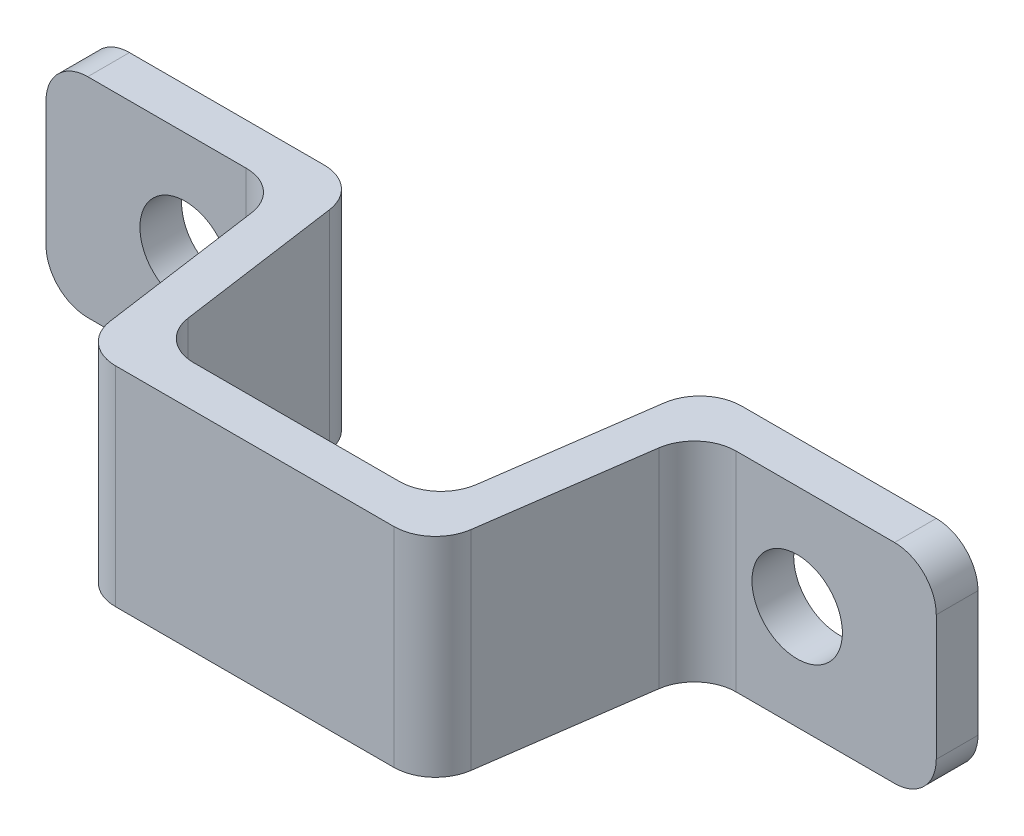
ISO-10303-21;
HEADER;
FILE_DESCRIPTION(('STEP AP214'),'2;1');
FILE_NAME('part.step','',(''),(''),'','','');
FILE_SCHEMA(('AUTOMOTIVE_DESIGN { 1 0 10303 214 1 1 1 1 }'));
ENDSEC;
DATA;
#1=APPLICATION_CONTEXT('core data for automotive mechanical design processes');
#2=APPLICATION_PROTOCOL_DEFINITION('international standard','automotive_design',2000,#1);
#3=PRODUCT_CONTEXT('',#1,'mechanical');
#4=PRODUCT('Part','Part','',(#3));
#5=PRODUCT_RELATED_PRODUCT_CATEGORY('part','',(#4));
#6=PRODUCT_DEFINITION_FORMATION('','',#4);
#7=PRODUCT_DEFINITION_CONTEXT('part definition',#1,'design');
#8=PRODUCT_DEFINITION('design','',#6,#7);
#9=PRODUCT_DEFINITION_SHAPE('','',#8);
#10=(LENGTH_UNIT() NAMED_UNIT(*) SI_UNIT(.MILLI.,.METRE.));
#11=(NAMED_UNIT(*) PLANE_ANGLE_UNIT() SI_UNIT($,.RADIAN.));
#12=(NAMED_UNIT(*) SI_UNIT($,.STERADIAN.) SOLID_ANGLE_UNIT());
#13=UNCERTAINTY_MEASURE_WITH_UNIT(LENGTH_MEASURE(1.E-05),#10,'distance_accuracy_value','');
#14=(GEOMETRIC_REPRESENTATION_CONTEXT(3) GLOBAL_UNCERTAINTY_ASSIGNED_CONTEXT((#13)) GLOBAL_UNIT_ASSIGNED_CONTEXT((#10,
#11,#12)) REPRESENTATION_CONTEXT('',''));
#15=CARTESIAN_POINT('',(0.,0.,0.));
#16=DIRECTION('',(0.,0.,1.));
#17=DIRECTION('',(1.,0.,0.));
#18=AXIS2_PLACEMENT_3D('',#15,#16,#17);
#19=CARTESIAN_POINT('',(32.,7.5,-17.));
#20=DIRECTION('',(-1.,0.,0.));
#21=DIRECTION('',(0.,0.,1.));
#22=AXIS2_PLACEMENT_3D('',#19,#20,#21);
#23=PLANE('',#22);
#24=DIRECTION('',(0.,-1.,0.));
#25=VECTOR('',#24,1.);
#26=CARTESIAN_POINT('',(32.,7.5,-17.));
#27=LINE('',#26,#25);
#28=CARTESIAN_POINT('',(32.,4.5,-17.));
#29=VERTEX_POINT('',#28);
#30=CARTESIAN_POINT('',(32.,-4.5,-17.));
#31=VERTEX_POINT('',#30);
#32=EDGE_CURVE('E262',#29,#31,#27,.T.);
#33=ORIENTED_EDGE('',*,*,#32,.T.);
#34=DIRECTION('',(0.,0.,-1.));
#35=VECTOR('',#34,1.);
#36=CARTESIAN_POINT('',(32.,-4.5,-17.));
#37=LINE('',#36,#35);
#38=CARTESIAN_POINT('',(32.,-4.5,-20.));
#39=VERTEX_POINT('',#38);
#40=EDGE_CURVE('E377',#31,#39,#37,.T.);
#41=ORIENTED_EDGE('',*,*,#40,.T.);
#42=DIRECTION('',(0.,-1.,0.));
#43=VECTOR('',#42,1.);
#44=CARTESIAN_POINT('',(32.,7.5,-20.));
#45=LINE('',#44,#43);
#46=CARTESIAN_POINT('',(32.,4.5,-20.));
#47=VERTEX_POINT('',#46);
#48=EDGE_CURVE('E227',#47,#39,#45,.T.);
#49=ORIENTED_EDGE('',*,*,#48,.F.);
#50=DIRECTION('',(0.,0.,-1.));
#51=VECTOR('',#50,1.);
#52=CARTESIAN_POINT('',(32.,4.5,-17.));
#53=LINE('',#52,#51);
#54=EDGE_CURVE('E374',#47,#29,#53,.F.);
#55=ORIENTED_EDGE('',*,*,#54,.T.);
#56=EDGE_LOOP('',(#33,#41,#49,#55));
#57=FACE_BOUND('',#56,.T.);
#58=ADVANCED_FACE('F44',(#57),#23,.F.);
#59=CARTESIAN_POINT('',(32.,7.5,-20.));
#60=DIRECTION('',(0.,0.,1.));
#61=DIRECTION('',(1.,0.,0.));
#62=AXIS2_PLACEMENT_3D('',#59,#60,#61);
#63=PLANE('',#62);
#64=CARTESIAN_POINT('',(22.,0.,-20.));
#65=DIRECTION('',(0.,0.,1.));
#66=DIRECTION('',(-1.,0.,0.));
#67=AXIS2_PLACEMENT_3D('',#64,#65,#66);
#68=CIRCLE('',#67,3.25);
#69=CARTESIAN_POINT('',(18.75,0.,-20.));
#70=VERTEX_POINT('',#69);
#71=EDGE_CURVE('E499',#70,#70,#68,.T.);
#72=ORIENTED_EDGE('',*,*,#71,.T.);
#73=EDGE_LOOP('',(#72));
#74=FACE_BOUND('',#73,.T.);
#75=ORIENTED_EDGE('',*,*,#48,.T.);
#76=CARTESIAN_POINT('',(29.,-4.5,-20.));
#77=DIRECTION('',(0.,0.,1.));
#78=DIRECTION('',(1.,0.,0.));
#79=AXIS2_PLACEMENT_3D('',#76,#77,#78);
#80=CIRCLE('',#79,3.);
#81=CARTESIAN_POINT('',(29.,-7.5,-20.));
#82=VERTEX_POINT('',#81);
#83=EDGE_CURVE('E384',#39,#82,#80,.F.);
#84=ORIENTED_EDGE('',*,*,#83,.T.);
#85=DIRECTION('',(-1.,0.,0.));
#86=VECTOR('',#85,1.);
#87=CARTESIAN_POINT('',(32.,-7.5,-20.));
#88=LINE('',#87,#86);
#89=CARTESIAN_POINT('',(15.,-7.5,-20.));
#90=VERTEX_POINT('',#89);
#91=EDGE_CURVE('E464',#82,#90,#88,.T.);
#92=ORIENTED_EDGE('',*,*,#91,.T.);
#93=DIRECTION('',(0.,-1.,0.));
#94=VECTOR('',#93,1.);
#95=CARTESIAN_POINT('',(15.,7.5,-20.));
#96=LINE('',#95,#94);
#97=CARTESIAN_POINT('',(15.,7.5,-20.));
#98=VERTEX_POINT('',#97);
#99=EDGE_CURVE('E309',#90,#98,#96,.F.);
#100=ORIENTED_EDGE('',*,*,#99,.T.);
#101=DIRECTION('',(-1.,0.,0.));
#102=VECTOR('',#101,1.);
#103=CARTESIAN_POINT('',(32.,7.5,-20.));
#104=LINE('',#103,#102);
#105=CARTESIAN_POINT('',(29.,7.5,-20.));
#106=VERTEX_POINT('',#105);
#107=EDGE_CURVE('E261',#106,#98,#104,.T.);
#108=ORIENTED_EDGE('',*,*,#107,.F.);
#109=CARTESIAN_POINT('',(29.,4.5,-20.));
#110=DIRECTION('',(0.,0.,1.));
#111=DIRECTION('',(1.,0.,0.));
#112=AXIS2_PLACEMENT_3D('',#109,#110,#111);
#113=CIRCLE('',#112,3.);
#114=EDGE_CURVE('E381',#106,#47,#113,.F.);
#115=ORIENTED_EDGE('',*,*,#114,.T.);
#116=EDGE_LOOP('',(#75,#84,#92,#100,#108,#115));
#117=FACE_BOUND('',#116,.T.);
#118=ADVANCED_FACE('F534',(#74,#117),#63,.F.);
#119=CARTESIAN_POINT('',(12.3926673331197,7.5,-20.));
#120=DIRECTION('',(0.990240166967667,0.,0.139371488202739));
#121=DIRECTION('',(0.139371488202739,0.,-0.990240166967667));
#122=AXIS2_PLACEMENT_3D('',#119,#120,#121);
#123=PLANE('',#122);
#124=DIRECTION('',(-0.139371488202739,0.,0.990240166967667));
#125=VECTOR('',#124,1.);
#126=CARTESIAN_POINT('',(12.3926673331197,7.5,-20.));
#127=LINE('',#126,#125);
#128=CARTESIAN_POINT('',(12.029279499097,7.5,-17.4181144646082));
#129=VERTEX_POINT('',#128);
#130=CARTESIAN_POINT('',(10.3633878340227,7.5,-5.58188553539178));
#131=VERTEX_POINT('',#130);
#132=EDGE_CURVE('E491',#129,#131,#127,.T.);
#133=ORIENTED_EDGE('',*,*,#132,.F.);
#134=DIRECTION('',(0.,-1.,0.));
#135=VECTOR('',#134,1.);
#136=CARTESIAN_POINT('',(12.029279499097,7.5,-17.4181144646082));
#137=LINE('',#136,#135);
#138=CARTESIAN_POINT('',(12.029279499097,-7.5,-17.4181144646082));
#139=VERTEX_POINT('',#138);
#140=EDGE_CURVE('E305',#129,#139,#137,.T.);
#141=ORIENTED_EDGE('',*,*,#140,.T.);
#142=DIRECTION('',(-0.139371488202739,0.,0.990240166967667));
#143=VECTOR('',#142,1.);
#144=CARTESIAN_POINT('',(12.3926673331197,-7.5,-20.));
#145=LINE('',#144,#143);
#146=CARTESIAN_POINT('',(10.3633878340227,-7.5,-5.58188553539178));
#147=VERTEX_POINT('',#146);
#148=EDGE_CURVE('E467',#139,#147,#145,.T.);
#149=ORIENTED_EDGE('',*,*,#148,.T.);
#150=DIRECTION('',(0.,-1.,0.));
#151=VECTOR('',#150,1.);
#152=CARTESIAN_POINT('',(10.3633878340227,7.5,-5.58188553539178));
#153=LINE('',#152,#151);
#154=EDGE_CURVE('E302',#147,#131,#153,.F.);
#155=ORIENTED_EDGE('',*,*,#154,.T.);
#156=EDGE_LOOP('',(#133,#141,#149,#155));
#157=FACE_BOUND('',#156,.T.);
#158=ADVANCED_FACE('F541',(#157),#123,.F.);
#159=CARTESIAN_POINT('',(-10.,7.5,-3.));
#160=DIRECTION('',(0.,0.,1.));
#161=DIRECTION('',(1.,0.,0.));
#162=AXIS2_PLACEMENT_3D('',#159,#160,#161);
#163=PLANE('',#162);
#164=DIRECTION('',(-1.,0.,0.));
#165=VECTOR('',#164,1.);
#166=CARTESIAN_POINT('',(-10.,7.5,-3.));
#167=LINE('',#166,#165);
#168=CARTESIAN_POINT('',(7.39266733311972,7.5,-3.));
#169=VERTEX_POINT('',#168);
#170=CARTESIAN_POINT('',(-7.39266733311972,7.5,-3.));
#171=VERTEX_POINT('',#170);
#172=EDGE_CURVE('E485',#169,#171,#167,.T.);
#173=ORIENTED_EDGE('',*,*,#172,.F.);
#174=DIRECTION('',(0.,-1.,0.));
#175=VECTOR('',#174,1.);
#176=CARTESIAN_POINT('',(7.39266733311972,-7.5,-3.));
#177=LINE('',#176,#175);
#178=CARTESIAN_POINT('',(7.39266733311972,-7.5,-3.));
#179=VERTEX_POINT('',#178);
#180=EDGE_CURVE('E316',#169,#179,#177,.T.);
#181=ORIENTED_EDGE('',*,*,#180,.T.);
#182=DIRECTION('',(-1.,0.,0.));
#183=VECTOR('',#182,1.);
#184=CARTESIAN_POINT('',(-10.,-7.5,-3.));
#185=LINE('',#184,#183);
#186=CARTESIAN_POINT('',(-7.39266733311972,-7.5,-3.));
#187=VERTEX_POINT('',#186);
#188=EDGE_CURVE('E242',#179,#187,#185,.T.);
#189=ORIENTED_EDGE('',*,*,#188,.T.);
#190=DIRECTION('',(0.,-1.,0.));
#191=VECTOR('',#190,1.);
#192=CARTESIAN_POINT('',(-7.39266733311972,7.5,-3.));
#193=LINE('',#192,#191);
#194=EDGE_CURVE('E313',#187,#171,#193,.F.);
#195=ORIENTED_EDGE('',*,*,#194,.T.);
#196=EDGE_LOOP('',(#173,#181,#189,#195));
#197=FACE_BOUND('',#196,.T.);
#198=ADVANCED_FACE('F477',(#197),#163,.F.);
#199=CARTESIAN_POINT('',(-12.3926673331197,7.5,-20.));
#200=DIRECTION('',(-0.990240166967667,0.,0.139371488202739));
#201=DIRECTION('',(0.139371488202739,0.,0.990240166967667));
#202=AXIS2_PLACEMENT_3D('',#199,#200,#201);
#203=PLANE('',#202);
#204=DIRECTION('',(-0.139371488202739,0.,-0.990240166967667));
#205=VECTOR('',#204,1.);
#206=CARTESIAN_POINT('',(-12.3926673331197,-7.5,-20.));
#207=LINE('',#206,#205);
#208=CARTESIAN_POINT('',(-10.3633878340227,-7.5,-5.58188553539178));
#209=VERTEX_POINT('',#208);
#210=CARTESIAN_POINT('',(-12.029279499097,-7.5,-17.4181144646082));
#211=VERTEX_POINT('',#210);
#212=EDGE_CURVE('E236',#209,#211,#207,.T.);
#213=ORIENTED_EDGE('',*,*,#212,.T.);
#214=DIRECTION('',(0.,-1.,0.));
#215=VECTOR('',#214,1.);
#216=CARTESIAN_POINT('',(-12.029279499097,7.5,-17.4181144646082));
#217=LINE('',#216,#215);
#218=CARTESIAN_POINT('',(-12.029279499097,7.5,-17.4181144646082));
#219=VERTEX_POINT('',#218);
#220=EDGE_CURVE('E211',#211,#219,#217,.F.);
#221=ORIENTED_EDGE('',*,*,#220,.T.);
#222=DIRECTION('',(-0.139371488202739,0.,-0.990240166967667));
#223=VECTOR('',#222,1.);
#224=CARTESIAN_POINT('',(-12.3926673331197,7.5,-20.));
#225=LINE('',#224,#223);
#226=CARTESIAN_POINT('',(-10.3633878340227,7.5,-5.58188553539178));
#227=VERTEX_POINT('',#226);
#228=EDGE_CURVE('E428',#227,#219,#225,.T.);
#229=ORIENTED_EDGE('',*,*,#228,.F.);
#230=DIRECTION('',(0.,-1.,0.));
#231=VECTOR('',#230,1.);
#232=CARTESIAN_POINT('',(-10.3633878340227,-7.5,-5.58188553539178));
#233=LINE('',#232,#231);
#234=EDGE_CURVE('E217',#227,#209,#233,.T.);
#235=ORIENTED_EDGE('',*,*,#234,.T.);
#236=EDGE_LOOP('',(#213,#221,#229,#235));
#237=FACE_BOUND('',#236,.T.);
#238=ADVANCED_FACE('F487',(#237),#203,.F.);
#239=CARTESIAN_POINT('',(-32.,7.5,-20.));
#240=DIRECTION('',(0.,0.,1.));
#241=DIRECTION('',(1.,0.,0.));
#242=AXIS2_PLACEMENT_3D('',#239,#240,#241);
#243=PLANE('',#242);
#244=CARTESIAN_POINT('',(-22.,0.,-20.));
#245=DIRECTION('',(0.,0.,1.));
#246=DIRECTION('',(1.,0.,0.));
#247=AXIS2_PLACEMENT_3D('',#244,#245,#246);
#248=CIRCLE('',#247,3.25);
#249=CARTESIAN_POINT('',(-18.75,0.,-20.));
#250=VERTEX_POINT('',#249);
#251=EDGE_CURVE('E468',#250,#250,#248,.T.);
#252=ORIENTED_EDGE('',*,*,#251,.T.);
#253=EDGE_LOOP('',(#252));
#254=FACE_BOUND('',#253,.T.);
#255=DIRECTION('',(-1.,0.,0.));
#256=VECTOR('',#255,1.);
#257=CARTESIAN_POINT('',(-32.,-7.5,-20.));
#258=LINE('',#257,#256);
#259=CARTESIAN_POINT('',(-15.,-7.5,-20.));
#260=VERTEX_POINT('',#259);
#261=CARTESIAN_POINT('',(-29.,-7.5,-20.));
#262=VERTEX_POINT('',#261);
#263=EDGE_CURVE('E222',#260,#262,#258,.T.);
#264=ORIENTED_EDGE('',*,*,#263,.T.);
#265=CARTESIAN_POINT('',(-29.,-4.5,-20.));
#266=DIRECTION('',(0.,0.,1.));
#267=DIRECTION('',(1.,0.,0.));
#268=AXIS2_PLACEMENT_3D('',#265,#266,#267);
#269=CIRCLE('',#268,3.);
#270=CARTESIAN_POINT('',(-32.,-4.5,-20.));
#271=VERTEX_POINT('',#270);
#272=EDGE_CURVE('E11',#262,#271,#269,.F.);
#273=ORIENTED_EDGE('',*,*,#272,.T.);
#274=DIRECTION('',(0.,-1.,0.));
#275=VECTOR('',#274,1.);
#276=CARTESIAN_POINT('',(-32.,7.5,-20.));
#277=LINE('',#276,#275);
#278=CARTESIAN_POINT('',(-32.,4.5,-20.));
#279=VERTEX_POINT('',#278);
#280=EDGE_CURVE('E271',#279,#271,#277,.T.);
#281=ORIENTED_EDGE('',*,*,#280,.F.);
#282=CARTESIAN_POINT('',(-29.,4.5,-20.));
#283=DIRECTION('',(0.,0.,1.));
#284=DIRECTION('',(1.,0.,0.));
#285=AXIS2_PLACEMENT_3D('',#282,#283,#284);
#286=CIRCLE('',#285,3.);
#287=CARTESIAN_POINT('',(-29.,7.5,-20.));
#288=VERTEX_POINT('',#287);
#289=EDGE_CURVE('E53',#279,#288,#286,.F.);
#290=ORIENTED_EDGE('',*,*,#289,.T.);
#291=DIRECTION('',(-1.,0.,0.));
#292=VECTOR('',#291,1.);
#293=CARTESIAN_POINT('',(-32.,7.5,-20.));
#294=LINE('',#293,#292);
#295=CARTESIAN_POINT('',(-15.,7.5,-20.));
#296=VERTEX_POINT('',#295);
#297=EDGE_CURVE('E224',#296,#288,#294,.T.);
#298=ORIENTED_EDGE('',*,*,#297,.F.);
#299=DIRECTION('',(0.,-1.,0.));
#300=VECTOR('',#299,1.);
#301=CARTESIAN_POINT('',(-15.,7.5,-20.));
#302=LINE('',#301,#300);
#303=EDGE_CURVE('E210',#296,#260,#302,.T.);
#304=ORIENTED_EDGE('',*,*,#303,.T.);
#305=EDGE_LOOP('',(#264,#273,#281,#290,#298,#304));
#306=FACE_BOUND('',#305,.T.);
#307=ADVANCED_FACE('F221',(#254,#306),#243,.F.);
#308=CARTESIAN_POINT('',(-32.,7.5,-17.));
#309=DIRECTION('',(1.,0.,0.));
#310=DIRECTION('',(0.,0.,-1.));
#311=AXIS2_PLACEMENT_3D('',#308,#309,#310);
#312=PLANE('',#311);
#313=ORIENTED_EDGE('',*,*,#280,.T.);
#314=DIRECTION('',(0.,0.,1.));
#315=VECTOR('',#314,1.);
#316=CARTESIAN_POINT('',(-32.,-4.5,-17.));
#317=LINE('',#316,#315);
#318=CARTESIAN_POINT('',(-32.,-4.5,-17.));
#319=VERTEX_POINT('',#318);
#320=EDGE_CURVE('E408',#271,#319,#317,.T.);
#321=ORIENTED_EDGE('',*,*,#320,.T.);
#322=DIRECTION('',(0.,-1.,0.));
#323=VECTOR('',#322,1.);
#324=CARTESIAN_POINT('',(-32.,7.5,-17.));
#325=LINE('',#324,#323);
#326=CARTESIAN_POINT('',(-32.,4.5,-17.));
#327=VERTEX_POINT('',#326);
#328=EDGE_CURVE('E266',#327,#319,#325,.T.);
#329=ORIENTED_EDGE('',*,*,#328,.F.);
#330=DIRECTION('',(0.,0.,1.));
#331=VECTOR('',#330,1.);
#332=CARTESIAN_POINT('',(-32.,4.5,-20.));
#333=LINE('',#332,#331);
#334=EDGE_CURVE('E65',#327,#279,#333,.F.);
#335=ORIENTED_EDGE('',*,*,#334,.T.);
#336=EDGE_LOOP('',(#313,#321,#329,#335));
#337=FACE_BOUND('',#336,.T.);
#338=ADVANCED_FACE('F432',(#337),#312,.F.);
#339=CARTESIAN_POINT('',(-15.,7.5,-17.));
#340=DIRECTION('',(0.,0.,-1.));
#341=DIRECTION('',(-1.,0.,0.));
#342=AXIS2_PLACEMENT_3D('',#339,#340,#341);
#343=PLANE('',#342);
#344=CARTESIAN_POINT('',(-22.,0.,-17.));
#345=DIRECTION('',(0.,0.,1.));
#346=DIRECTION('',(1.,0.,0.));
#347=AXIS2_PLACEMENT_3D('',#344,#345,#346);
#348=CIRCLE('',#347,3.25);
#349=CARTESIAN_POINT('',(-18.75,0.,-17.));
#350=VERTEX_POINT('',#349);
#351=EDGE_CURVE('E507',#350,#350,#348,.T.);
#352=ORIENTED_EDGE('',*,*,#351,.F.);
#353=EDGE_LOOP('',(#352));
#354=FACE_BOUND('',#353,.T.);
#355=ORIENTED_EDGE('',*,*,#328,.T.);
#356=CARTESIAN_POINT('',(-29.,-4.5,-17.));
#357=DIRECTION('',(0.,0.,-1.));
#358=DIRECTION('',(-1.,0.,0.));
#359=AXIS2_PLACEMENT_3D('',#356,#357,#358);
#360=CIRCLE('',#359,3.);
#361=CARTESIAN_POINT('',(-29.,-7.5,-17.));
#362=VERTEX_POINT('',#361);
#363=EDGE_CURVE('E415',#319,#362,#360,.F.);
#364=ORIENTED_EDGE('',*,*,#363,.T.);
#365=DIRECTION('',(1.,0.,0.));
#366=VECTOR('',#365,1.);
#367=CARTESIAN_POINT('',(-15.,-7.5,-17.));
#368=LINE('',#367,#366);
#369=CARTESIAN_POINT('',(-17.6073326668803,-7.5,-17.));
#370=VERTEX_POINT('',#369);
#371=EDGE_CURVE('E235',#362,#370,#368,.T.);
#372=ORIENTED_EDGE('',*,*,#371,.T.);
#373=DIRECTION('',(0.,-1.,0.));
#374=VECTOR('',#373,1.);
#375=CARTESIAN_POINT('',(-17.6073326668803,7.5,-17.));
#376=LINE('',#375,#374);
#377=CARTESIAN_POINT('',(-17.6073326668803,7.5,-17.));
#378=VERTEX_POINT('',#377);
#379=EDGE_CURVE('E345',#370,#378,#376,.F.);
#380=ORIENTED_EDGE('',*,*,#379,.T.);
#381=DIRECTION('',(1.,0.,0.));
#382=VECTOR('',#381,1.);
#383=CARTESIAN_POINT('',(-15.,7.5,-17.));
#384=LINE('',#383,#382);
#385=CARTESIAN_POINT('',(-29.,7.5,-17.));
#386=VERTEX_POINT('',#385);
#387=EDGE_CURVE('E427',#386,#378,#384,.T.);
#388=ORIENTED_EDGE('',*,*,#387,.F.);
#389=CARTESIAN_POINT('',(-29.,4.5,-17.));
#390=DIRECTION('',(0.,0.,-1.));
#391=DIRECTION('',(-1.,0.,0.));
#392=AXIS2_PLACEMENT_3D('',#389,#390,#391);
#393=CIRCLE('',#392,3.);
#394=EDGE_CURVE('E412',#386,#327,#393,.F.);
#395=ORIENTED_EDGE('',*,*,#394,.T.);
#396=EDGE_LOOP('',(#355,#364,#372,#380,#388,#395));
#397=FACE_BOUND('',#396,.T.);
#398=ADVANCED_FACE('F431',(#354,#397),#343,.F.);
#399=CARTESIAN_POINT('',(-12.6073326668803,7.5,0.));
#400=DIRECTION('',(0.990240166967667,0.,-0.139371488202738));
#401=DIRECTION('',(-0.139371488202738,0.,-0.990240166967667));
#402=AXIS2_PLACEMENT_3D('',#399,#400,#401);
#403=PLANE('',#402);
#404=DIRECTION('',(0.139371488202738,0.,0.990240166967668));
#405=VECTOR('',#404,1.);
#406=CARTESIAN_POINT('',(-12.6073326668803,-7.5,0.));
#407=LINE('',#406,#405);
#408=CARTESIAN_POINT('',(-14.6366121659773,-7.5,-14.4181144646082));
#409=VERTEX_POINT('',#408);
#410=CARTESIAN_POINT('',(-12.970720500903,-7.5,-2.58188553539179));
#411=VERTEX_POINT('',#410);
#412=EDGE_CURVE('E240',#409,#411,#407,.T.);
#413=ORIENTED_EDGE('',*,*,#412,.T.);
#414=DIRECTION('',(0.,-1.,0.));
#415=VECTOR('',#414,1.);
#416=CARTESIAN_POINT('',(-12.970720500903,7.5,-2.58188553539178));
#417=LINE('',#416,#415);
#418=CARTESIAN_POINT('',(-12.970720500903,7.5,-2.58188553539179));
#419=VERTEX_POINT('',#418);
#420=EDGE_CURVE('E342',#411,#419,#417,.F.);
#421=ORIENTED_EDGE('',*,*,#420,.T.);
#422=DIRECTION('',(0.139371488202738,0.,0.990240166967668));
#423=VECTOR('',#422,1.);
#424=CARTESIAN_POINT('',(-12.6073326668803,7.5,0.));
#425=LINE('',#424,#423);
#426=CARTESIAN_POINT('',(-14.6366121659773,7.5,-14.4181144646082));
#427=VERTEX_POINT('',#426);
#428=EDGE_CURVE('E444',#427,#419,#425,.T.);
#429=ORIENTED_EDGE('',*,*,#428,.F.);
#430=DIRECTION('',(0.,-1.,0.));
#431=VECTOR('',#430,1.);
#432=CARTESIAN_POINT('',(-14.6366121659773,-7.5,-14.4181144646082));
#433=LINE('',#432,#431);
#434=EDGE_CURVE('E338',#427,#409,#433,.T.);
#435=ORIENTED_EDGE('',*,*,#434,.T.);
#436=EDGE_LOOP('',(#413,#421,#429,#435));
#437=FACE_BOUND('',#436,.T.);
#438=ADVANCED_FACE('F447',(#437),#403,.F.);
#439=CARTESIAN_POINT('',(-12.6073326668803,7.5,0.));
#440=DIRECTION('',(0.,0.,-1.));
#441=DIRECTION('',(-1.,0.,0.));
#442=AXIS2_PLACEMENT_3D('',#439,#440,#441);
#443=PLANE('',#442);
#444=DIRECTION('',(1.,0.,0.));
#445=VECTOR('',#444,1.);
#446=CARTESIAN_POINT('',(-12.6073326668803,-7.5,0.));
#447=LINE('',#446,#445);
#448=CARTESIAN_POINT('',(-10.,-7.5,0.));
#449=VERTEX_POINT('',#448);
#450=CARTESIAN_POINT('',(10.,-7.5,0.));
#451=VERTEX_POINT('',#450);
#452=EDGE_CURVE('E249',#449,#451,#447,.T.);
#453=ORIENTED_EDGE('',*,*,#452,.T.);
#454=DIRECTION('',(0.,-1.,0.));
#455=VECTOR('',#454,1.);
#456=CARTESIAN_POINT('',(10.,7.5,0.));
#457=LINE('',#456,#455);
#458=CARTESIAN_POINT('',(10.,7.5,0.));
#459=VERTEX_POINT('',#458);
#460=EDGE_CURVE('E335',#451,#459,#457,.F.);
#461=ORIENTED_EDGE('',*,*,#460,.T.);
#462=DIRECTION('',(1.,0.,0.));
#463=VECTOR('',#462,1.);
#464=CARTESIAN_POINT('',(-12.6073326668803,7.5,0.));
#465=LINE('',#464,#463);
#466=CARTESIAN_POINT('',(-10.,7.5,0.));
#467=VERTEX_POINT('',#466);
#468=EDGE_CURVE('E450',#467,#459,#465,.T.);
#469=ORIENTED_EDGE('',*,*,#468,.F.);
#470=DIRECTION('',(0.,-1.,0.));
#471=VECTOR('',#470,1.);
#472=CARTESIAN_POINT('',(-10.,7.5,0.));
#473=LINE('',#472,#471);
#474=EDGE_CURVE('E331',#467,#449,#473,.T.);
#475=ORIENTED_EDGE('',*,*,#474,.T.);
#476=EDGE_LOOP('',(#453,#461,#469,#475));
#477=FACE_BOUND('',#476,.T.);
#478=ADVANCED_FACE('F530',(#477),#443,.F.);
#479=CARTESIAN_POINT('',(12.6073326668803,7.5,0.));
#480=DIRECTION('',(-0.990240166967667,0.,-0.139371488202738));
#481=DIRECTION('',(-0.139371488202738,0.,0.990240166967667));
#482=AXIS2_PLACEMENT_3D('',#479,#480,#481);
#483=PLANE('',#482);
#484=DIRECTION('',(0.139371488202738,0.,-0.990240166967668));
#485=VECTOR('',#484,1.);
#486=CARTESIAN_POINT('',(12.6073326668803,-7.5,0.));
#487=LINE('',#486,#485);
#488=CARTESIAN_POINT('',(12.970720500903,-7.5,-2.58188553539179));
#489=VERTEX_POINT('',#488);
#490=CARTESIAN_POINT('',(14.6366121659773,-7.5,-14.4181144646082));
#491=VERTEX_POINT('',#490);
#492=EDGE_CURVE('E253',#489,#491,#487,.T.);
#493=ORIENTED_EDGE('',*,*,#492,.T.);
#494=DIRECTION('',(0.,-1.,0.));
#495=VECTOR('',#494,1.);
#496=CARTESIAN_POINT('',(14.6366121659773,7.5,-14.4181144646082));
#497=LINE('',#496,#495);
#498=CARTESIAN_POINT('',(14.6366121659773,7.5,-14.4181144646082));
#499=VERTEX_POINT('',#498);
#500=EDGE_CURVE('E328',#491,#499,#497,.F.);
#501=ORIENTED_EDGE('',*,*,#500,.T.);
#502=DIRECTION('',(0.139371488202738,0.,-0.990240166967668));
#503=VECTOR('',#502,1.);
#504=CARTESIAN_POINT('',(12.6073326668803,7.5,0.));
#505=LINE('',#504,#503);
#506=CARTESIAN_POINT('',(12.970720500903,7.5,-2.58188553539179));
#507=VERTEX_POINT('',#506);
#508=EDGE_CURVE('E455',#507,#499,#505,.T.);
#509=ORIENTED_EDGE('',*,*,#508,.F.);
#510=DIRECTION('',(0.,-1.,0.));
#511=VECTOR('',#510,1.);
#512=CARTESIAN_POINT('',(12.970720500903,7.5,-2.58188553539178));
#513=LINE('',#512,#511);
#514=EDGE_CURVE('E324',#507,#489,#513,.T.);
#515=ORIENTED_EDGE('',*,*,#514,.T.);
#516=EDGE_LOOP('',(#493,#501,#509,#515));
#517=FACE_BOUND('',#516,.T.);
#518=ADVANCED_FACE('F691',(#517),#483,.F.);
#519=CARTESIAN_POINT('',(15.,7.5,-17.));
#520=DIRECTION('',(0.,0.,-1.));
#521=DIRECTION('',(-1.,0.,0.));
#522=AXIS2_PLACEMENT_3D('',#519,#520,#521);
#523=PLANE('',#522);
#524=CARTESIAN_POINT('',(22.,0.,-17.));
#525=DIRECTION('',(0.,0.,1.));
#526=DIRECTION('',(-1.,0.,0.));
#527=AXIS2_PLACEMENT_3D('',#524,#525,#526);
#528=CIRCLE('',#527,3.25);
#529=CARTESIAN_POINT('',(18.75,0.,-17.));
#530=VERTEX_POINT('',#529);
#531=EDGE_CURVE('E503',#530,#530,#528,.T.);
#532=ORIENTED_EDGE('',*,*,#531,.F.);
#533=EDGE_LOOP('',(#532));
#534=FACE_BOUND('',#533,.T.);
#535=DIRECTION('',(1.,0.,0.));
#536=VECTOR('',#535,1.);
#537=CARTESIAN_POINT('',(15.,-7.5,-17.));
#538=LINE('',#537,#536);
#539=CARTESIAN_POINT('',(17.6073326668803,-7.5,-17.));
#540=VERTEX_POINT('',#539);
#541=CARTESIAN_POINT('',(29.,-7.5,-17.));
#542=VERTEX_POINT('',#541);
#543=EDGE_CURVE('E257',#540,#542,#538,.T.);
#544=ORIENTED_EDGE('',*,*,#543,.T.);
#545=CARTESIAN_POINT('',(29.,-4.5,-17.));
#546=DIRECTION('',(0.,0.,-1.));
#547=DIRECTION('',(-1.,0.,0.));
#548=AXIS2_PLACEMENT_3D('',#545,#546,#547);
#549=CIRCLE('',#548,3.);
#550=EDGE_CURVE('E395',#542,#31,#549,.F.);
#551=ORIENTED_EDGE('',*,*,#550,.T.);
#552=ORIENTED_EDGE('',*,*,#32,.F.);
#553=CARTESIAN_POINT('',(29.,4.5,-17.));
#554=DIRECTION('',(0.,0.,-1.));
#555=DIRECTION('',(-1.,0.,0.));
#556=AXIS2_PLACEMENT_3D('',#553,#554,#555);
#557=CIRCLE('',#556,3.);
#558=CARTESIAN_POINT('',(29.,7.5,-17.));
#559=VERTEX_POINT('',#558);
#560=EDGE_CURVE('E392',#29,#559,#557,.F.);
#561=ORIENTED_EDGE('',*,*,#560,.T.);
#562=DIRECTION('',(1.,0.,0.));
#563=VECTOR('',#562,1.);
#564=CARTESIAN_POINT('',(15.,7.5,-17.));
#565=LINE('',#564,#563);
#566=CARTESIAN_POINT('',(17.6073326668803,7.5,-17.));
#567=VERTEX_POINT('',#566);
#568=EDGE_CURVE('E267',#567,#559,#565,.T.);
#569=ORIENTED_EDGE('',*,*,#568,.F.);
#570=DIRECTION('',(0.,-1.,0.));
#571=VECTOR('',#570,1.);
#572=CARTESIAN_POINT('',(17.6073326668803,-7.5,-17.));
#573=LINE('',#572,#571);
#574=EDGE_CURVE('E320',#567,#540,#573,.T.);
#575=ORIENTED_EDGE('',*,*,#574,.T.);
#576=EDGE_LOOP('',(#544,#551,#552,#561,#569,#575));
#577=FACE_BOUND('',#576,.T.);
#578=ADVANCED_FACE('F683',(#534,#577),#523,.F.);
#579=CARTESIAN_POINT('',(0.,7.5,0.));
#580=DIRECTION('',(0.,1.,0.));
#581=DIRECTION('',(0.,0.,1.));
#582=AXIS2_PLACEMENT_3D('',#579,#580,#581);
#583=PLANE('',#582);
#584=ORIENTED_EDGE('',*,*,#568,.T.);
#585=DIRECTION('',(0.,0.,-1.));
#586=VECTOR('',#585,1.);
#587=CARTESIAN_POINT('',(29.,7.5,-20.));
#588=LINE('',#587,#586);
#589=EDGE_CURVE('E402',#559,#106,#588,.T.);
#590=ORIENTED_EDGE('',*,*,#589,.T.);
#591=ORIENTED_EDGE('',*,*,#107,.T.);
#592=CARTESIAN_POINT('',(15.,7.5,-17.));
#593=DIRECTION('',(0.,1.,0.));
#594=DIRECTION('',(0.,0.,1.));
#595=AXIS2_PLACEMENT_3D('',#592,#593,#594);
#596=CIRCLE('',#595,3.);
#597=EDGE_CURVE('E296',#98,#129,#596,.T.);
#598=ORIENTED_EDGE('',*,*,#597,.T.);
#599=ORIENTED_EDGE('',*,*,#132,.T.);
#600=CARTESIAN_POINT('',(7.39266733311972,7.5,-6.));
#601=DIRECTION('',(0.,1.,0.));
#602=DIRECTION('',(0.,0.,1.));
#603=AXIS2_PLACEMENT_3D('',#600,#601,#602);
#604=CIRCLE('',#603,3.);
#605=EDGE_CURVE('E352',#131,#169,#604,.F.);
#606=ORIENTED_EDGE('',*,*,#605,.T.);
#607=ORIENTED_EDGE('',*,*,#172,.T.);
#608=CARTESIAN_POINT('',(-7.39266733311972,7.5,-6.));
#609=DIRECTION('',(0.,1.,0.));
#610=DIRECTION('',(0.,0.,1.));
#611=AXIS2_PLACEMENT_3D('',#608,#609,#610);
#612=CIRCLE('',#611,3.);
#613=EDGE_CURVE('E358',#171,#227,#612,.F.);
#614=ORIENTED_EDGE('',*,*,#613,.T.);
#615=ORIENTED_EDGE('',*,*,#228,.T.);
#616=CARTESIAN_POINT('',(-15.,7.5,-17.));
#617=DIRECTION('',(0.,1.,0.));
#618=DIRECTION('',(0.,0.,1.));
#619=AXIS2_PLACEMENT_3D('',#616,#617,#618);
#620=CIRCLE('',#619,3.);
#621=EDGE_CURVE('E299',#219,#296,#620,.T.);
#622=ORIENTED_EDGE('',*,*,#621,.T.);
#623=ORIENTED_EDGE('',*,*,#297,.T.);
#624=DIRECTION('',(0.,0.,1.));
#625=VECTOR('',#624,1.);
#626=CARTESIAN_POINT('',(-29.,7.5,-17.));
#627=LINE('',#626,#625);
#628=EDGE_CURVE('E398',#288,#386,#627,.T.);
#629=ORIENTED_EDGE('',*,*,#628,.T.);
#630=ORIENTED_EDGE('',*,*,#387,.T.);
#631=CARTESIAN_POINT('',(-17.6073326668803,7.5,-14.));
#632=DIRECTION('',(0.,1.,0.));
#633=DIRECTION('',(0.,0.,1.));
#634=AXIS2_PLACEMENT_3D('',#631,#632,#633);
#635=CIRCLE('',#634,3.);
#636=EDGE_CURVE('E371',#378,#427,#635,.F.);
#637=ORIENTED_EDGE('',*,*,#636,.T.);
#638=ORIENTED_EDGE('',*,*,#428,.T.);
#639=CARTESIAN_POINT('',(-10.,7.5,-3.));
#640=DIRECTION('',(0.,1.,0.));
#641=DIRECTION('',(0.,0.,1.));
#642=AXIS2_PLACEMENT_3D('',#639,#640,#641);
#643=CIRCLE('',#642,3.);
#644=EDGE_CURVE('E290',#419,#467,#643,.T.);
#645=ORIENTED_EDGE('',*,*,#644,.T.);
#646=ORIENTED_EDGE('',*,*,#468,.T.);
#647=CARTESIAN_POINT('',(10.,7.5,-3.));
#648=DIRECTION('',(0.,1.,0.));
#649=DIRECTION('',(0.,0.,1.));
#650=AXIS2_PLACEMENT_3D('',#647,#648,#649);
#651=CIRCLE('',#650,3.);
#652=EDGE_CURVE('E293',#459,#507,#651,.T.);
#653=ORIENTED_EDGE('',*,*,#652,.T.);
#654=ORIENTED_EDGE('',*,*,#508,.T.);
#655=CARTESIAN_POINT('',(17.6073326668803,7.5,-14.));
#656=DIRECTION('',(0.,1.,0.));
#657=DIRECTION('',(0.,0.,1.));
#658=AXIS2_PLACEMENT_3D('',#655,#656,#657);
#659=CIRCLE('',#658,3.);
#660=EDGE_CURVE('E364',#499,#567,#659,.F.);
#661=ORIENTED_EDGE('',*,*,#660,.T.);
#662=EDGE_LOOP('',(#584,#590,#591,#598,#599,#606,#607,#614,#615,#622,#623,#629,#630,#637,#638,
#645,#646,#653,#654,#661));
#663=FACE_BOUND('',#662,.T.);
#664=ADVANCED_FACE('F423',(#663),#583,.T.);
#665=CARTESIAN_POINT('',(0.,-7.5,0.));
#666=DIRECTION('',(0.,1.,0.));
#667=DIRECTION('',(0.,0.,1.));
#668=AXIS2_PLACEMENT_3D('',#665,#666,#667);
#669=PLANE('',#668);
#670=ORIENTED_EDGE('',*,*,#91,.F.);
#671=DIRECTION('',(0.,0.,-1.));
#672=VECTOR('',#671,1.);
#673=CARTESIAN_POINT('',(29.,-7.5,0.));
#674=LINE('',#673,#672);
#675=EDGE_CURVE('E389',#82,#542,#674,.F.);
#676=ORIENTED_EDGE('',*,*,#675,.T.);
#677=ORIENTED_EDGE('',*,*,#543,.F.);
#678=CARTESIAN_POINT('',(17.6073326668803,-7.5,-14.));
#679=DIRECTION('',(0.,1.,0.));
#680=DIRECTION('',(0.,0.,1.));
#681=AXIS2_PLACEMENT_3D('',#678,#679,#680);
#682=CIRCLE('',#681,3.);
#683=EDGE_CURVE('E361',#540,#491,#682,.T.);
#684=ORIENTED_EDGE('',*,*,#683,.T.);
#685=ORIENTED_EDGE('',*,*,#492,.F.);
#686=CARTESIAN_POINT('',(10.,-7.5,-3.));
#687=DIRECTION('',(0.,1.,0.));
#688=DIRECTION('',(0.,0.,1.));
#689=AXIS2_PLACEMENT_3D('',#686,#687,#688);
#690=CIRCLE('',#689,3.);
#691=EDGE_CURVE('E279',#489,#451,#690,.F.);
#692=ORIENTED_EDGE('',*,*,#691,.T.);
#693=ORIENTED_EDGE('',*,*,#452,.F.);
#694=CARTESIAN_POINT('',(-10.,-7.5,-3.));
#695=DIRECTION('',(0.,1.,0.));
#696=DIRECTION('',(0.,0.,1.));
#697=AXIS2_PLACEMENT_3D('',#694,#695,#696);
#698=CIRCLE('',#697,3.);
#699=EDGE_CURVE('E226',#449,#411,#698,.F.);
#700=ORIENTED_EDGE('',*,*,#699,.T.);
#701=ORIENTED_EDGE('',*,*,#412,.F.);
#702=CARTESIAN_POINT('',(-17.6073326668803,-7.5,-14.));
#703=DIRECTION('',(0.,1.,0.));
#704=DIRECTION('',(0.,0.,1.));
#705=AXIS2_PLACEMENT_3D('',#702,#703,#704);
#706=CIRCLE('',#705,3.);
#707=EDGE_CURVE('E367',#409,#370,#706,.T.);
#708=ORIENTED_EDGE('',*,*,#707,.T.);
#709=ORIENTED_EDGE('',*,*,#371,.F.);
#710=DIRECTION('',(0.,0.,1.));
#711=VECTOR('',#710,1.);
#712=CARTESIAN_POINT('',(-29.,-7.5,0.));
#713=LINE('',#712,#711);
#714=EDGE_CURVE('E233',#362,#262,#713,.F.);
#715=ORIENTED_EDGE('',*,*,#714,.T.);
#716=ORIENTED_EDGE('',*,*,#263,.F.);
#717=CARTESIAN_POINT('',(-15.,-7.5,-17.));
#718=DIRECTION('',(0.,1.,0.));
#719=DIRECTION('',(0.,0.,1.));
#720=AXIS2_PLACEMENT_3D('',#717,#718,#719);
#721=CIRCLE('',#720,3.);
#722=EDGE_CURVE('E206',#260,#211,#721,.F.);
#723=ORIENTED_EDGE('',*,*,#722,.T.);
#724=ORIENTED_EDGE('',*,*,#212,.F.);
#725=CARTESIAN_POINT('',(-7.39266733311972,-7.5,-6.));
#726=DIRECTION('',(0.,1.,0.));
#727=DIRECTION('',(0.,0.,1.));
#728=AXIS2_PLACEMENT_3D('',#725,#726,#727);
#729=CIRCLE('',#728,3.);
#730=EDGE_CURVE('E355',#209,#187,#729,.T.);
#731=ORIENTED_EDGE('',*,*,#730,.T.);
#732=ORIENTED_EDGE('',*,*,#188,.F.);
#733=CARTESIAN_POINT('',(7.39266733311972,-7.5,-6.));
#734=DIRECTION('',(0.,1.,0.));
#735=DIRECTION('',(0.,0.,1.));
#736=AXIS2_PLACEMENT_3D('',#733,#734,#735);
#737=CIRCLE('',#736,3.);
#738=EDGE_CURVE('E349',#179,#147,#737,.T.);
#739=ORIENTED_EDGE('',*,*,#738,.T.);
#740=ORIENTED_EDGE('',*,*,#148,.F.);
#741=CARTESIAN_POINT('',(15.,-7.5,-17.));
#742=DIRECTION('',(0.,1.,0.));
#743=DIRECTION('',(0.,0.,1.));
#744=AXIS2_PLACEMENT_3D('',#741,#742,#743);
#745=CIRCLE('',#744,3.);
#746=EDGE_CURVE('E218',#139,#90,#745,.F.);
#747=ORIENTED_EDGE('',*,*,#746,.T.);
#748=EDGE_LOOP('',(#670,#676,#677,#684,#685,#692,#693,#700,#701,#708,#709,#715,#716,#723,#724,
#731,#732,#739,#740,#747));
#749=FACE_BOUND('',#748,.T.);
#750=ADVANCED_FACE('F230',(#749),#669,.F.);
#751=CARTESIAN_POINT('',(22.,0.,-20.));
#752=DIRECTION('',(0.,0.,1.));
#753=DIRECTION('',(1.,0.,0.));
#754=AXIS2_PLACEMENT_3D('',#751,#752,#753);
#755=CYLINDRICAL_SURFACE('',#754,3.25);
#756=ORIENTED_EDGE('',*,*,#71,.F.);
#757=EDGE_LOOP('',(#756));
#758=FACE_BOUND('',#757,.T.);
#759=ORIENTED_EDGE('',*,*,#531,.T.);
#760=EDGE_LOOP('',(#759));
#761=FACE_BOUND('',#760,.T.);
#762=ADVANCED_FACE('F519',(#758,#761),#755,.F.);
#763=CARTESIAN_POINT('',(-22.,0.,-20.));
#764=DIRECTION('',(0.,0.,1.));
#765=DIRECTION('',(1.,0.,0.));
#766=AXIS2_PLACEMENT_3D('',#763,#764,#765);
#767=CYLINDRICAL_SURFACE('',#766,3.25);
#768=ORIENTED_EDGE('',*,*,#251,.F.);
#769=EDGE_LOOP('',(#768));
#770=FACE_BOUND('',#769,.T.);
#771=ORIENTED_EDGE('',*,*,#351,.T.);
#772=EDGE_LOOP('',(#771));
#773=FACE_BOUND('',#772,.T.);
#774=ADVANCED_FACE('F516',(#770,#773),#767,.F.);
#775=CARTESIAN_POINT('',(-15.,7.5,-17.));
#776=DIRECTION('',(0.,-1.,0.));
#777=DIRECTION('',(0.,0.,-1.));
#778=AXIS2_PLACEMENT_3D('',#775,#776,#777);
#779=CYLINDRICAL_SURFACE('',#778,3.);
#780=ORIENTED_EDGE('',*,*,#621,.F.);
#781=ORIENTED_EDGE('',*,*,#220,.F.);
#782=ORIENTED_EDGE('',*,*,#722,.F.);
#783=ORIENTED_EDGE('',*,*,#303,.F.);
#784=EDGE_LOOP('',(#780,#781,#782,#783));
#785=FACE_BOUND('',#784,.T.);
#786=ADVANCED_FACE('F209',(#785),#779,.T.);
#787=CARTESIAN_POINT('',(15.,7.5,-17.));
#788=DIRECTION('',(0.,-1.,0.));
#789=DIRECTION('',(0.,0.,-1.));
#790=AXIS2_PLACEMENT_3D('',#787,#788,#789);
#791=CYLINDRICAL_SURFACE('',#790,3.);
#792=ORIENTED_EDGE('',*,*,#597,.F.);
#793=ORIENTED_EDGE('',*,*,#99,.F.);
#794=ORIENTED_EDGE('',*,*,#746,.F.);
#795=ORIENTED_EDGE('',*,*,#140,.F.);
#796=EDGE_LOOP('',(#792,#793,#794,#795));
#797=FACE_BOUND('',#796,.T.);
#798=ADVANCED_FACE('F548',(#797),#791,.T.);
#799=CARTESIAN_POINT('',(7.39266733311972,7.5,-6.));
#800=DIRECTION('',(0.,1.,0.));
#801=DIRECTION('',(0.,0.,1.));
#802=AXIS2_PLACEMENT_3D('',#799,#800,#801);
#803=CYLINDRICAL_SURFACE('',#802,3.);
#804=ORIENTED_EDGE('',*,*,#605,.F.);
#805=ORIENTED_EDGE('',*,*,#154,.F.);
#806=ORIENTED_EDGE('',*,*,#738,.F.);
#807=ORIENTED_EDGE('',*,*,#180,.F.);
#808=EDGE_LOOP('',(#804,#805,#806,#807));
#809=FACE_BOUND('',#808,.T.);
#810=ADVANCED_FACE('F551',(#809),#803,.F.);
#811=CARTESIAN_POINT('',(-7.39266733311972,7.5,-6.));
#812=DIRECTION('',(0.,1.,0.));
#813=DIRECTION('',(0.,0.,1.));
#814=AXIS2_PLACEMENT_3D('',#811,#812,#813);
#815=CYLINDRICAL_SURFACE('',#814,3.);
#816=ORIENTED_EDGE('',*,*,#613,.F.);
#817=ORIENTED_EDGE('',*,*,#194,.F.);
#818=ORIENTED_EDGE('',*,*,#730,.F.);
#819=ORIENTED_EDGE('',*,*,#234,.F.);
#820=EDGE_LOOP('',(#816,#817,#818,#819));
#821=FACE_BOUND('',#820,.T.);
#822=ADVANCED_FACE('F482',(#821),#815,.F.);
#823=CARTESIAN_POINT('',(17.6073326668803,7.5,-14.));
#824=DIRECTION('',(0.,1.,0.));
#825=DIRECTION('',(0.,0.,1.));
#826=AXIS2_PLACEMENT_3D('',#823,#824,#825);
#827=CYLINDRICAL_SURFACE('',#826,3.);
#828=ORIENTED_EDGE('',*,*,#660,.F.);
#829=ORIENTED_EDGE('',*,*,#500,.F.);
#830=ORIENTED_EDGE('',*,*,#683,.F.);
#831=ORIENTED_EDGE('',*,*,#574,.F.);
#832=EDGE_LOOP('',(#828,#829,#830,#831));
#833=FACE_BOUND('',#832,.T.);
#834=ADVANCED_FACE('F558',(#833),#827,.F.);
#835=CARTESIAN_POINT('',(10.,7.5,-3.));
#836=DIRECTION('',(0.,-1.,0.));
#837=DIRECTION('',(0.,0.,-1.));
#838=AXIS2_PLACEMENT_3D('',#835,#836,#837);
#839=CYLINDRICAL_SURFACE('',#838,3.);
#840=ORIENTED_EDGE('',*,*,#652,.F.);
#841=ORIENTED_EDGE('',*,*,#460,.F.);
#842=ORIENTED_EDGE('',*,*,#691,.F.);
#843=ORIENTED_EDGE('',*,*,#514,.F.);
#844=EDGE_LOOP('',(#840,#841,#842,#843));
#845=FACE_BOUND('',#844,.T.);
#846=ADVANCED_FACE('F561',(#845),#839,.T.);
#847=CARTESIAN_POINT('',(-10.,7.5,-3.));
#848=DIRECTION('',(0.,-1.,0.));
#849=DIRECTION('',(0.,0.,-1.));
#850=AXIS2_PLACEMENT_3D('',#847,#848,#849);
#851=CYLINDRICAL_SURFACE('',#850,3.);
#852=ORIENTED_EDGE('',*,*,#644,.F.);
#853=ORIENTED_EDGE('',*,*,#420,.F.);
#854=ORIENTED_EDGE('',*,*,#699,.F.);
#855=ORIENTED_EDGE('',*,*,#474,.F.);
#856=EDGE_LOOP('',(#852,#853,#854,#855));
#857=FACE_BOUND('',#856,.T.);
#858=ADVANCED_FACE('F565',(#857),#851,.T.);
#859=CARTESIAN_POINT('',(-17.6073326668803,7.5,-14.));
#860=DIRECTION('',(0.,1.,0.));
#861=DIRECTION('',(0.,0.,1.));
#862=AXIS2_PLACEMENT_3D('',#859,#860,#861);
#863=CYLINDRICAL_SURFACE('',#862,3.);
#864=ORIENTED_EDGE('',*,*,#636,.F.);
#865=ORIENTED_EDGE('',*,*,#379,.F.);
#866=ORIENTED_EDGE('',*,*,#707,.F.);
#867=ORIENTED_EDGE('',*,*,#434,.F.);
#868=EDGE_LOOP('',(#864,#865,#866,#867));
#869=FACE_BOUND('',#868,.T.);
#870=ADVANCED_FACE('F441',(#869),#863,.F.);
#871=CARTESIAN_POINT('',(29.,-4.5,-17.));
#872=DIRECTION('',(0.,0.,-1.));
#873=DIRECTION('',(-1.,0.,0.));
#874=AXIS2_PLACEMENT_3D('',#871,#872,#873);
#875=CYLINDRICAL_SURFACE('',#874,3.);
#876=ORIENTED_EDGE('',*,*,#550,.F.);
#877=ORIENTED_EDGE('',*,*,#675,.F.);
#878=ORIENTED_EDGE('',*,*,#83,.F.);
#879=ORIENTED_EDGE('',*,*,#40,.F.);
#880=EDGE_LOOP('',(#876,#877,#878,#879));
#881=FACE_BOUND('',#880,.T.);
#882=ADVANCED_FACE('F571',(#881),#875,.T.);
#883=CARTESIAN_POINT('',(29.,4.5,0.));
#884=DIRECTION('',(0.,0.,1.));
#885=DIRECTION('',(1.,0.,0.));
#886=AXIS2_PLACEMENT_3D('',#883,#884,#885);
#887=CYLINDRICAL_SURFACE('',#886,3.);
#888=ORIENTED_EDGE('',*,*,#560,.F.);
#889=ORIENTED_EDGE('',*,*,#54,.F.);
#890=ORIENTED_EDGE('',*,*,#114,.F.);
#891=ORIENTED_EDGE('',*,*,#589,.F.);
#892=EDGE_LOOP('',(#888,#889,#890,#891));
#893=FACE_BOUND('',#892,.T.);
#894=ADVANCED_FACE('F574',(#893),#887,.T.);
#895=CARTESIAN_POINT('',(-29.,-4.5,-17.));
#896=DIRECTION('',(0.,0.,1.));
#897=DIRECTION('',(1.,0.,0.));
#898=AXIS2_PLACEMENT_3D('',#895,#896,#897);
#899=CYLINDRICAL_SURFACE('',#898,3.);
#900=ORIENTED_EDGE('',*,*,#272,.F.);
#901=ORIENTED_EDGE('',*,*,#714,.F.);
#902=ORIENTED_EDGE('',*,*,#363,.F.);
#903=ORIENTED_EDGE('',*,*,#320,.F.);
#904=EDGE_LOOP('',(#900,#901,#902,#903));
#905=FACE_BOUND('',#904,.T.);
#906=ADVANCED_FACE('F435',(#905),#899,.T.);
#907=CARTESIAN_POINT('',(-29.,4.5,0.));
#908=DIRECTION('',(0.,0.,-1.));
#909=DIRECTION('',(-1.,0.,0.));
#910=AXIS2_PLACEMENT_3D('',#907,#908,#909);
#911=CYLINDRICAL_SURFACE('',#910,3.);
#912=ORIENTED_EDGE('',*,*,#289,.F.);
#913=ORIENTED_EDGE('',*,*,#334,.F.);
#914=ORIENTED_EDGE('',*,*,#394,.F.);
#915=ORIENTED_EDGE('',*,*,#628,.F.);
#916=EDGE_LOOP('',(#912,#913,#914,#915));
#917=FACE_BOUND('',#916,.T.);
#918=ADVANCED_FACE('F46',(#917),#911,.T.);
#919=CLOSED_SHELL('',(#58,#118,#158,#198,#238,#307,#338,#398,#438,#478,#518,#578,#664,#750,#762,
#774,#786,#798,#810,#822,#834,#846,#858,#870,#882,#894,#906,#918));
#920=MANIFOLD_SOLID_BREP('B2',#919);
#921=ADVANCED_BREP_SHAPE_REPRESENTATION('',(#18,#920),#14);
#922=SHAPE_DEFINITION_REPRESENTATION(#9,#921);
ENDSEC;
END-ISO-10303-21;
